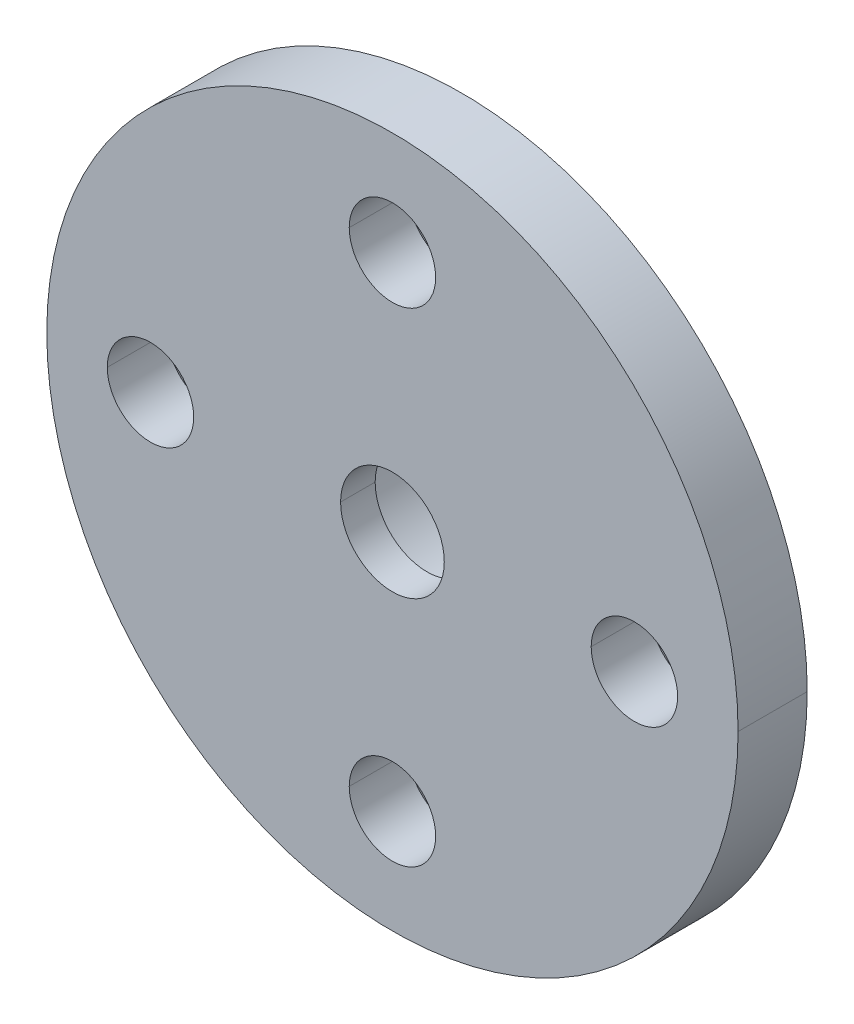
ISO-10303-21;
HEADER;
FILE_DESCRIPTION(('STEP AP214'),'2;1');
FILE_NAME('part.step','',(''),(''),'','','');
FILE_SCHEMA(('AUTOMOTIVE_DESIGN { 1 0 10303 214 1 1 1 1 }'));
ENDSEC;
DATA;
#1=APPLICATION_CONTEXT('core data for automotive mechanical design processes');
#2=APPLICATION_PROTOCOL_DEFINITION('international standard','automotive_design',2000,#1);
#3=PRODUCT_CONTEXT('',#1,'mechanical');
#4=PRODUCT('Part','Part','',(#3));
#5=PRODUCT_RELATED_PRODUCT_CATEGORY('part','',(#4));
#6=PRODUCT_DEFINITION_FORMATION('','',#4);
#7=PRODUCT_DEFINITION_CONTEXT('part definition',#1,'design');
#8=PRODUCT_DEFINITION('design','',#6,#7);
#9=PRODUCT_DEFINITION_SHAPE('','',#8);
#10=(LENGTH_UNIT() NAMED_UNIT(*) SI_UNIT(.MILLI.,.METRE.));
#11=(NAMED_UNIT(*) PLANE_ANGLE_UNIT() SI_UNIT($,.RADIAN.));
#12=(NAMED_UNIT(*) SI_UNIT($,.STERADIAN.) SOLID_ANGLE_UNIT());
#13=UNCERTAINTY_MEASURE_WITH_UNIT(LENGTH_MEASURE(1.E-05),#10,'distance_accuracy_value','');
#14=(GEOMETRIC_REPRESENTATION_CONTEXT(3) GLOBAL_UNCERTAINTY_ASSIGNED_CONTEXT((#13)) GLOBAL_UNIT_ASSIGNED_CONTEXT((#10,
#11,#12)) REPRESENTATION_CONTEXT('',''));
#15=CARTESIAN_POINT('',(0.,0.,0.));
#16=DIRECTION('',(0.,0.,1.));
#17=DIRECTION('',(1.,0.,0.));
#18=AXIS2_PLACEMENT_3D('',#15,#16,#17);
#19=CARTESIAN_POINT('',(0.,0.,-2.));
#20=DIRECTION('',(0.,0.,-1.));
#21=DIRECTION('',(-1.,0.,0.));
#22=AXIS2_PLACEMENT_3D('',#19,#20,#21);
#23=CONICAL_SURFACE('',#22,2.75,0.785398163397449);
#24=DIRECTION('',(0.707106781186548,0.,-0.707106781186547));
#25=VECTOR('',#24,1.);
#26=CARTESIAN_POINT('',(2.75,0.,-2.));
#27=LINE('',#26,#25);
#28=CARTESIAN_POINT('',(2.75,0.,-2.));
#29=VERTEX_POINT('',#28);
#30=CARTESIAN_POINT('',(3.25,0.,-2.5));
#31=VERTEX_POINT('',#30);
#32=EDGE_CURVE('E627',#29,#31,#27,.T.);
#33=ORIENTED_EDGE('',*,*,#32,.F.);
#34=CARTESIAN_POINT('',(0.,0.,-2.));
#35=DIRECTION('',(0.,0.,-1.));
#36=DIRECTION('',(-1.,0.,0.));
#37=AXIS2_PLACEMENT_3D('',#34,#35,#36);
#38=CIRCLE('',#37,2.75);
#39=CARTESIAN_POINT('',(-2.75,0.,-2.));
#40=VERTEX_POINT('',#39);
#41=EDGE_CURVE('E10',#40,#29,#38,.T.);
#42=ORIENTED_EDGE('',*,*,#41,.F.);
#43=DIRECTION('',(-0.707106781186548,0.,-0.707106781186547));
#44=VECTOR('',#43,1.);
#45=CARTESIAN_POINT('',(-2.75,0.,-2.));
#46=LINE('',#45,#44);
#47=CARTESIAN_POINT('',(-3.25,0.,-2.5));
#48=VERTEX_POINT('',#47);
#49=EDGE_CURVE('E231',#40,#48,#46,.T.);
#50=ORIENTED_EDGE('',*,*,#49,.T.);
#51=CARTESIAN_POINT('',(0.,0.,-2.5));
#52=DIRECTION('',(0.,0.,1.));
#53=DIRECTION('',(-1.,0.,0.));
#54=AXIS2_PLACEMENT_3D('',#51,#52,#53);
#55=CIRCLE('',#54,3.25);
#56=EDGE_CURVE('E429',#31,#48,#55,.T.);
#57=ORIENTED_EDGE('',*,*,#56,.F.);
#58=EDGE_LOOP('',(#33,#42,#50,#57));
#59=FACE_BOUND('',#58,.T.);
#60=ADVANCED_FACE('F15',(#59),#23,.F.);
#61=CARTESIAN_POINT('',(0.,0.,2.001));
#62=DIRECTION('',(0.,0.,-1.));
#63=DIRECTION('',(-1.,0.,0.));
#64=AXIS2_PLACEMENT_3D('',#61,#62,#63);
#65=CYLINDRICAL_SURFACE('',#64,1.5);
#66=DIRECTION('',(0.,0.,-1.));
#67=VECTOR('',#66,1.);
#68=CARTESIAN_POINT('',(1.5,0.,2.001));
#69=LINE('',#68,#67);
#70=CARTESIAN_POINT('',(1.5,0.,2.));
#71=VERTEX_POINT('',#70);
#72=CARTESIAN_POINT('',(1.5,0.,1.));
#73=VERTEX_POINT('',#72);
#74=EDGE_CURVE('E213',#71,#73,#69,.T.);
#75=ORIENTED_EDGE('',*,*,#74,.F.);
#76=CARTESIAN_POINT('',(0.,0.,2.));
#77=DIRECTION('',(0.,0.,-1.));
#78=DIRECTION('',(1.,0.,0.));
#79=AXIS2_PLACEMENT_3D('',#76,#77,#78);
#80=CIRCLE('',#79,1.5);
#81=CARTESIAN_POINT('',(-1.5,0.,2.));
#82=VERTEX_POINT('',#81);
#83=EDGE_CURVE('E208',#82,#71,#80,.T.);
#84=ORIENTED_EDGE('',*,*,#83,.F.);
#85=DIRECTION('',(0.,0.,-1.));
#86=VECTOR('',#85,1.);
#87=CARTESIAN_POINT('',(-1.5,0.,2.001));
#88=LINE('',#87,#86);
#89=CARTESIAN_POINT('',(-1.5,0.,1.));
#90=VERTEX_POINT('',#89);
#91=EDGE_CURVE('E210',#82,#90,#88,.T.);
#92=ORIENTED_EDGE('',*,*,#91,.T.);
#93=CARTESIAN_POINT('',(0.,0.,1.));
#94=DIRECTION('',(0.,0.,-1.));
#95=DIRECTION('',(-1.,0.,0.));
#96=AXIS2_PLACEMENT_3D('',#93,#94,#95);
#97=CIRCLE('',#96,1.5);
#98=EDGE_CURVE('E19',#90,#73,#97,.T.);
#99=ORIENTED_EDGE('',*,*,#98,.T.);
#100=EDGE_LOOP('',(#75,#84,#92,#99));
#101=FACE_BOUND('',#100,.T.);
#102=ADVANCED_FACE('F17',(#101),#65,.F.);
#103=CARTESIAN_POINT('',(0.,0.,9.77817459305202));
#104=DIRECTION('',(0.,0.,-1.));
#105=DIRECTION('',(-1.,0.,0.));
#106=AXIS2_PLACEMENT_3D('',#103,#104,#105);
#107=CYLINDRICAL_SURFACE('',#106,2.75);
#108=DIRECTION('',(0.,0.,-1.));
#109=VECTOR('',#108,1.);
#110=CARTESIAN_POINT('',(2.75,0.,9.77817459305202));
#111=LINE('',#110,#109);
#112=CARTESIAN_POINT('',(2.75,0.,1.));
#113=VERTEX_POINT('',#112);
#114=EDGE_CURVE('E246',#113,#29,#111,.T.);
#115=ORIENTED_EDGE('',*,*,#114,.F.);
#116=CARTESIAN_POINT('',(0.,0.,1.));
#117=DIRECTION('',(0.,0.,-1.));
#118=DIRECTION('',(1.,0.,0.));
#119=AXIS2_PLACEMENT_3D('',#116,#117,#118);
#120=CIRCLE('',#119,2.75);
#121=CARTESIAN_POINT('',(-2.75,0.,1.));
#122=VERTEX_POINT('',#121);
#123=EDGE_CURVE('E431',#122,#113,#120,.T.);
#124=ORIENTED_EDGE('',*,*,#123,.F.);
#125=DIRECTION('',(0.,0.,-1.));
#126=VECTOR('',#125,1.);
#127=CARTESIAN_POINT('',(-2.75,0.,9.77817459305202));
#128=LINE('',#127,#126);
#129=EDGE_CURVE('E250',#122,#40,#128,.T.);
#130=ORIENTED_EDGE('',*,*,#129,.T.);
#131=ORIENTED_EDGE('',*,*,#41,.T.);
#132=EDGE_LOOP('',(#115,#124,#130,#131));
#133=FACE_BOUND('',#132,.T.);
#134=ADVANCED_FACE('F496',(#133),#107,.F.);
#135=CARTESIAN_POINT('',(0.,0.,1.));
#136=DIRECTION('',(0.,0.,1.));
#137=DIRECTION('',(1.,0.,0.));
#138=AXIS2_PLACEMENT_3D('',#135,#136,#137);
#139=PLANE('',#138);
#140=ORIENTED_EDGE('',*,*,#98,.F.);
#141=CARTESIAN_POINT('',(0.,0.,1.));
#142=DIRECTION('',(0.,0.,-1.));
#143=DIRECTION('',(-1.,0.,0.));
#144=AXIS2_PLACEMENT_3D('',#141,#142,#143);
#145=CIRCLE('',#144,1.5);
#146=EDGE_CURVE('E224',#73,#90,#145,.T.);
#147=ORIENTED_EDGE('',*,*,#146,.F.);
#148=EDGE_LOOP('',(#140,#147));
#149=FACE_BOUND('',#148,.T.);
#150=ORIENTED_EDGE('',*,*,#123,.T.);
#151=CARTESIAN_POINT('',(0.,0.,1.));
#152=DIRECTION('',(0.,0.,-1.));
#153=DIRECTION('',(1.,0.,0.));
#154=AXIS2_PLACEMENT_3D('',#151,#152,#153);
#155=CIRCLE('',#154,2.75);
#156=EDGE_CURVE('E226',#113,#122,#155,.T.);
#157=ORIENTED_EDGE('',*,*,#156,.T.);
#158=EDGE_LOOP('',(#150,#157));
#159=FACE_BOUND('',#158,.T.);
#160=ADVANCED_FACE('F442',(#149,#159),#139,.F.);
#161=CARTESIAN_POINT('',(0.,0.,-2.5));
#162=DIRECTION('',(0.,0.,-1.));
#163=DIRECTION('',(0.,-1.,0.));
#164=AXIS2_PLACEMENT_3D('',#161,#162,#163);
#165=PLANE('',#164);
#166=CARTESIAN_POINT('',(0.,0.,-2.5));
#167=DIRECTION('',(0.,0.,1.));
#168=DIRECTION('',(-1.,0.,0.));
#169=AXIS2_PLACEMENT_3D('',#166,#167,#168);
#170=CIRCLE('',#169,3.25);
#171=EDGE_CURVE('E240',#48,#31,#170,.T.);
#172=ORIENTED_EDGE('',*,*,#171,.T.);
#173=ORIENTED_EDGE('',*,*,#56,.T.);
#174=EDGE_LOOP('',(#172,#173));
#175=FACE_BOUND('',#174,.T.);
#176=CARTESIAN_POINT('',(0.,0.,-2.5));
#177=DIRECTION('',(0.,0.,-1.));
#178=DIRECTION('',(-1.,0.,0.));
#179=AXIS2_PLACEMENT_3D('',#176,#177,#178);
#180=CIRCLE('',#179,4.5);
#181=CARTESIAN_POINT('',(4.5,0.,-2.5));
#182=VERTEX_POINT('',#181);
#183=CARTESIAN_POINT('',(-4.5,0.,-2.5));
#184=VERTEX_POINT('',#183);
#185=EDGE_CURVE('E428',#182,#184,#180,.T.);
#186=ORIENTED_EDGE('',*,*,#185,.T.);
#187=CARTESIAN_POINT('',(0.,0.,-2.5));
#188=DIRECTION('',(0.,0.,-1.));
#189=DIRECTION('',(-1.,0.,0.));
#190=AXIS2_PLACEMENT_3D('',#187,#188,#189);
#191=CIRCLE('',#190,4.5);
#192=EDGE_CURVE('E254',#184,#182,#191,.T.);
#193=ORIENTED_EDGE('',*,*,#192,.T.);
#194=EDGE_LOOP('',(#186,#193));
#195=FACE_BOUND('',#194,.T.);
#196=ADVANCED_FACE('F884',(#175,#195),#165,.T.);
#197=CARTESIAN_POINT('',(0.,0.,-2.5));
#198=DIRECTION('',(0.,0.,1.));
#199=DIRECTION('',(1.,0.,0.));
#200=AXIS2_PLACEMENT_3D('',#197,#198,#199);
#201=CYLINDRICAL_SURFACE('',#200,4.5);
#202=DIRECTION('',(0.,0.,1.));
#203=VECTOR('',#202,1.);
#204=CARTESIAN_POINT('',(-4.5,0.,-2.5));
#205=LINE('',#204,#203);
#206=CARTESIAN_POINT('',(-4.5,0.,0.));
#207=VERTEX_POINT('',#206);
#208=EDGE_CURVE('E269',#184,#207,#205,.T.);
#209=ORIENTED_EDGE('',*,*,#208,.F.);
#210=ORIENTED_EDGE('',*,*,#185,.F.);
#211=DIRECTION('',(0.,0.,1.));
#212=VECTOR('',#211,1.);
#213=CARTESIAN_POINT('',(4.5,0.,-2.5));
#214=LINE('',#213,#212);
#215=CARTESIAN_POINT('',(4.5,0.,0.));
#216=VERTEX_POINT('',#215);
#217=EDGE_CURVE('E255',#182,#216,#214,.T.);
#218=ORIENTED_EDGE('',*,*,#217,.T.);
#219=CARTESIAN_POINT('',(0.,0.,0.));
#220=DIRECTION('',(0.,0.,-1.));
#221=DIRECTION('',(-1.,0.,0.));
#222=AXIS2_PLACEMENT_3D('',#219,#220,#221);
#223=CIRCLE('',#222,4.5);
#224=EDGE_CURVE('E411',#216,#207,#223,.T.);
#225=ORIENTED_EDGE('',*,*,#224,.T.);
#226=EDGE_LOOP('',(#209,#210,#218,#225));
#227=FACE_BOUND('',#226,.T.);
#228=ADVANCED_FACE('F892',(#227),#201,.T.);
#229=CARTESIAN_POINT('',(-7.,0.,0.));
#230=DIRECTION('',(0.,0.,-1.));
#231=DIRECTION('',(-1.,0.,0.));
#232=AXIS2_PLACEMENT_3D('',#229,#230,#231);
#233=CONICAL_SURFACE('',#232,1.525,0.785398163397448);
#234=DIRECTION('',(0.707106781186548,0.,-0.707106781186548));
#235=VECTOR('',#234,1.);
#236=CARTESIAN_POINT('',(-5.475,0.,0.));
#237=LINE('',#236,#235);
#238=CARTESIAN_POINT('',(-5.75,0.,0.275000000000012));
#239=VERTEX_POINT('',#238);
#240=CARTESIAN_POINT('',(-5.475,0.,0.));
#241=VERTEX_POINT('',#240);
#242=EDGE_CURVE('E261',#239,#241,#237,.T.);
#243=ORIENTED_EDGE('',*,*,#242,.F.);
#244=CARTESIAN_POINT('',(-7.,0.,0.275000000000012));
#245=DIRECTION('',(0.,0.,-1.));
#246=DIRECTION('',(-1.,0.,0.));
#247=AXIS2_PLACEMENT_3D('',#244,#245,#246);
#248=CIRCLE('',#247,1.24999999999999);
#249=CARTESIAN_POINT('',(-8.25,0.,0.275000000000012));
#250=VERTEX_POINT('',#249);
#251=EDGE_CURVE('E276',#250,#239,#248,.T.);
#252=ORIENTED_EDGE('',*,*,#251,.F.);
#253=DIRECTION('',(-0.707106781186548,0.,-0.707106781186548));
#254=VECTOR('',#253,1.);
#255=CARTESIAN_POINT('',(-8.525,0.,0.));
#256=LINE('',#255,#254);
#257=CARTESIAN_POINT('',(-8.525,0.,0.));
#258=VERTEX_POINT('',#257);
#259=EDGE_CURVE('E281',#250,#258,#256,.T.);
#260=ORIENTED_EDGE('',*,*,#259,.T.);
#261=CARTESIAN_POINT('',(-7.,0.,0.));
#262=DIRECTION('',(0.,0.,-1.));
#263=DIRECTION('',(-1.,0.,0.));
#264=AXIS2_PLACEMENT_3D('',#261,#262,#263);
#265=CIRCLE('',#264,1.525);
#266=EDGE_CURVE('E414',#258,#241,#265,.T.);
#267=ORIENTED_EDGE('',*,*,#266,.T.);
#268=EDGE_LOOP('',(#243,#252,#260,#267));
#269=FACE_BOUND('',#268,.T.);
#270=ADVANCED_FACE('F511',(#269),#233,.F.);
#271=CARTESIAN_POINT('',(-7.,0.,0.));
#272=DIRECTION('',(0.,0.,-1.));
#273=DIRECTION('',(-1.,0.,0.));
#274=AXIS2_PLACEMENT_3D('',#271,#272,#273);
#275=CYLINDRICAL_SURFACE('',#274,1.25);
#276=DIRECTION('',(0.,0.,-1.));
#277=VECTOR('',#276,1.);
#278=CARTESIAN_POINT('',(-5.75,0.,0.));
#279=LINE('',#278,#277);
#280=CARTESIAN_POINT('',(-5.75,0.,2.));
#281=VERTEX_POINT('',#280);
#282=EDGE_CURVE('E285',#281,#239,#279,.T.);
#283=ORIENTED_EDGE('',*,*,#282,.F.);
#284=CARTESIAN_POINT('',(-7.,0.,2.));
#285=DIRECTION('',(0.,0.,-1.));
#286=DIRECTION('',(-1.,0.,0.));
#287=AXIS2_PLACEMENT_3D('',#284,#285,#286);
#288=CIRCLE('',#287,1.25);
#289=CARTESIAN_POINT('',(-8.25,0.,2.));
#290=VERTEX_POINT('',#289);
#291=EDGE_CURVE('E218',#290,#281,#288,.T.);
#292=ORIENTED_EDGE('',*,*,#291,.F.);
#293=DIRECTION('',(0.,0.,-1.));
#294=VECTOR('',#293,1.);
#295=CARTESIAN_POINT('',(-8.25,0.,0.));
#296=LINE('',#295,#294);
#297=EDGE_CURVE('E289',#290,#250,#296,.T.);
#298=ORIENTED_EDGE('',*,*,#297,.T.);
#299=ORIENTED_EDGE('',*,*,#251,.T.);
#300=EDGE_LOOP('',(#283,#292,#298,#299));
#301=FACE_BOUND('',#300,.T.);
#302=ADVANCED_FACE('F507',(#301),#275,.F.);
#303=CARTESIAN_POINT('',(0.,7.,0.));
#304=DIRECTION('',(0.,0.,-1.));
#305=DIRECTION('',(-1.,0.,0.));
#306=AXIS2_PLACEMENT_3D('',#303,#304,#305);
#307=CONICAL_SURFACE('',#306,1.525,0.785398163397448);
#308=DIRECTION('',(0.707106781186548,0.,-0.707106781186548));
#309=VECTOR('',#308,1.);
#310=CARTESIAN_POINT('',(1.525,7.,0.));
#311=LINE('',#310,#309);
#312=CARTESIAN_POINT('',(1.24999999999999,7.,0.275000000000012));
#313=VERTEX_POINT('',#312);
#314=CARTESIAN_POINT('',(1.525,7.,0.));
#315=VERTEX_POINT('',#314);
#316=EDGE_CURVE('E297',#313,#315,#311,.T.);
#317=ORIENTED_EDGE('',*,*,#316,.F.);
#318=CARTESIAN_POINT('',(0.,7.,0.275000000000012));
#319=DIRECTION('',(0.,0.,-1.));
#320=DIRECTION('',(-1.,0.,0.));
#321=AXIS2_PLACEMENT_3D('',#318,#319,#320);
#322=CIRCLE('',#321,1.24999999999999);
#323=CARTESIAN_POINT('',(-1.24999999999999,7.,0.275000000000012));
#324=VERTEX_POINT('',#323);
#325=EDGE_CURVE('E273',#324,#313,#322,.T.);
#326=ORIENTED_EDGE('',*,*,#325,.F.);
#327=DIRECTION('',(-0.707106781186548,0.,-0.707106781186548));
#328=VECTOR('',#327,1.);
#329=CARTESIAN_POINT('',(-1.525,7.,0.));
#330=LINE('',#329,#328);
#331=CARTESIAN_POINT('',(-1.525,7.,0.));
#332=VERTEX_POINT('',#331);
#333=EDGE_CURVE('E311',#324,#332,#330,.T.);
#334=ORIENTED_EDGE('',*,*,#333,.T.);
#335=CARTESIAN_POINT('',(0.,7.,0.));
#336=DIRECTION('',(0.,0.,-1.));
#337=DIRECTION('',(-1.,0.,0.));
#338=AXIS2_PLACEMENT_3D('',#335,#336,#337);
#339=CIRCLE('',#338,1.525);
#340=EDGE_CURVE('E368',#332,#315,#339,.T.);
#341=ORIENTED_EDGE('',*,*,#340,.T.);
#342=EDGE_LOOP('',(#317,#326,#334,#341));
#343=FACE_BOUND('',#342,.T.);
#344=ADVANCED_FACE('F510',(#343),#307,.F.);
#345=CARTESIAN_POINT('',(0.,7.,0.));
#346=DIRECTION('',(0.,0.,-1.));
#347=DIRECTION('',(-1.,0.,0.));
#348=AXIS2_PLACEMENT_3D('',#345,#346,#347);
#349=CYLINDRICAL_SURFACE('',#348,1.25);
#350=DIRECTION('',(0.,0.,-1.));
#351=VECTOR('',#350,1.);
#352=CARTESIAN_POINT('',(1.25,7.,0.));
#353=LINE('',#352,#351);
#354=CARTESIAN_POINT('',(1.25,7.,2.));
#355=VERTEX_POINT('',#354);
#356=EDGE_CURVE('E316',#355,#313,#353,.T.);
#357=ORIENTED_EDGE('',*,*,#356,.F.);
#358=CARTESIAN_POINT('',(0.,7.,2.));
#359=DIRECTION('',(0.,0.,-1.));
#360=DIRECTION('',(-1.,0.,0.));
#361=AXIS2_PLACEMENT_3D('',#358,#359,#360);
#362=CIRCLE('',#361,1.25);
#363=CARTESIAN_POINT('',(-1.25,7.,2.));
#364=VERTEX_POINT('',#363);
#365=EDGE_CURVE('E402',#364,#355,#362,.T.);
#366=ORIENTED_EDGE('',*,*,#365,.F.);
#367=DIRECTION('',(0.,0.,-1.));
#368=VECTOR('',#367,1.);
#369=CARTESIAN_POINT('',(-1.25,7.,0.));
#370=LINE('',#369,#368);
#371=EDGE_CURVE('E323',#364,#324,#370,.T.);
#372=ORIENTED_EDGE('',*,*,#371,.T.);
#373=ORIENTED_EDGE('',*,*,#325,.T.);
#374=EDGE_LOOP('',(#357,#366,#372,#373));
#375=FACE_BOUND('',#374,.T.);
#376=ADVANCED_FACE('F917',(#375),#349,.F.);
#377=CARTESIAN_POINT('',(7.,0.,0.));
#378=DIRECTION('',(0.,0.,-1.));
#379=DIRECTION('',(-1.,0.,0.));
#380=AXIS2_PLACEMENT_3D('',#377,#378,#379);
#381=CONICAL_SURFACE('',#380,1.525,0.785398163397452);
#382=DIRECTION('',(0.70710678118655,0.,-0.707106781186545));
#383=VECTOR('',#382,1.);
#384=CARTESIAN_POINT('',(8.525,0.,0.));
#385=LINE('',#384,#383);
#386=CARTESIAN_POINT('',(8.25,0.,0.275000000000012));
#387=VERTEX_POINT('',#386);
#388=CARTESIAN_POINT('',(8.525,0.,0.));
#389=VERTEX_POINT('',#388);
#390=EDGE_CURVE('E337',#387,#389,#385,.T.);
#391=ORIENTED_EDGE('',*,*,#390,.F.);
#392=CARTESIAN_POINT('',(7.,0.,0.275000000000012));
#393=DIRECTION('',(0.,0.,-1.));
#394=DIRECTION('',(-1.,0.,0.));
#395=AXIS2_PLACEMENT_3D('',#392,#393,#394);
#396=CIRCLE('',#395,1.24999999999999);
#397=CARTESIAN_POINT('',(5.75,0.,0.275000000000012));
#398=VERTEX_POINT('',#397);
#399=EDGE_CURVE('E277',#398,#387,#396,.T.);
#400=ORIENTED_EDGE('',*,*,#399,.F.);
#401=DIRECTION('',(-0.70710678118655,0.,-0.707106781186545));
#402=VECTOR('',#401,1.);
#403=CARTESIAN_POINT('',(5.475,0.,0.));
#404=LINE('',#403,#402);
#405=CARTESIAN_POINT('',(5.475,0.,0.));
#406=VERTEX_POINT('',#405);
#407=EDGE_CURVE('E345',#398,#406,#404,.T.);
#408=ORIENTED_EDGE('',*,*,#407,.T.);
#409=CARTESIAN_POINT('',(7.,0.,0.));
#410=DIRECTION('',(0.,0.,-1.));
#411=DIRECTION('',(-1.,0.,0.));
#412=AXIS2_PLACEMENT_3D('',#409,#410,#411);
#413=CIRCLE('',#412,1.525);
#414=EDGE_CURVE('E364',#406,#389,#413,.T.);
#415=ORIENTED_EDGE('',*,*,#414,.T.);
#416=EDGE_LOOP('',(#391,#400,#408,#415));
#417=FACE_BOUND('',#416,.T.);
#418=ADVANCED_FACE('F927',(#417),#381,.F.);
#419=CARTESIAN_POINT('',(7.,0.,0.));
#420=DIRECTION('',(0.,0.,-1.));
#421=DIRECTION('',(-1.,0.,0.));
#422=AXIS2_PLACEMENT_3D('',#419,#420,#421);
#423=CYLINDRICAL_SURFACE('',#422,1.25);
#424=DIRECTION('',(0.,0.,-1.));
#425=VECTOR('',#424,1.);
#426=CARTESIAN_POINT('',(8.25,0.,0.));
#427=LINE('',#426,#425);
#428=CARTESIAN_POINT('',(8.25,0.,2.));
#429=VERTEX_POINT('',#428);
#430=EDGE_CURVE('E307',#429,#387,#427,.T.);
#431=ORIENTED_EDGE('',*,*,#430,.F.);
#432=CARTESIAN_POINT('',(7.,0.,2.));
#433=DIRECTION('',(0.,0.,-1.));
#434=DIRECTION('',(-1.,0.,0.));
#435=AXIS2_PLACEMENT_3D('',#432,#433,#434);
#436=CIRCLE('',#435,1.25);
#437=CARTESIAN_POINT('',(5.75,0.,2.));
#438=VERTEX_POINT('',#437);
#439=EDGE_CURVE('E405',#438,#429,#436,.T.);
#440=ORIENTED_EDGE('',*,*,#439,.F.);
#441=DIRECTION('',(0.,0.,-1.));
#442=VECTOR('',#441,1.);
#443=CARTESIAN_POINT('',(5.75,0.,0.));
#444=LINE('',#443,#442);
#445=EDGE_CURVE('E302',#438,#398,#444,.T.);
#446=ORIENTED_EDGE('',*,*,#445,.T.);
#447=ORIENTED_EDGE('',*,*,#399,.T.);
#448=EDGE_LOOP('',(#431,#440,#446,#447));
#449=FACE_BOUND('',#448,.T.);
#450=ADVANCED_FACE('F938',(#449),#423,.F.);
#451=CARTESIAN_POINT('',(0.,-7.,0.));
#452=DIRECTION('',(0.,0.,-1.));
#453=DIRECTION('',(-1.,0.,0.));
#454=AXIS2_PLACEMENT_3D('',#451,#452,#453);
#455=CONICAL_SURFACE('',#454,1.525,0.785398163397448);
#456=DIRECTION('',(0.707106781186548,0.,-0.707106781186548));
#457=VECTOR('',#456,1.);
#458=CARTESIAN_POINT('',(1.525,-7.,0.));
#459=LINE('',#458,#457);
#460=CARTESIAN_POINT('',(1.24999999999999,-7.,0.275000000000012));
#461=VERTEX_POINT('',#460);
#462=CARTESIAN_POINT('',(1.525,-7.,0.));
#463=VERTEX_POINT('',#462);
#464=EDGE_CURVE('E333',#461,#463,#459,.T.);
#465=ORIENTED_EDGE('',*,*,#464,.F.);
#466=CARTESIAN_POINT('',(0.,-7.,0.275000000000012));
#467=DIRECTION('',(0.,0.,-1.));
#468=DIRECTION('',(-1.,0.,0.));
#469=AXIS2_PLACEMENT_3D('',#466,#467,#468);
#470=CIRCLE('',#469,1.24999999999999);
#471=CARTESIAN_POINT('',(-1.24999999999999,-7.,0.275000000000012));
#472=VERTEX_POINT('',#471);
#473=EDGE_CURVE('E421',#472,#461,#470,.T.);
#474=ORIENTED_EDGE('',*,*,#473,.F.);
#475=DIRECTION('',(-0.707106781186548,0.,-0.707106781186548));
#476=VECTOR('',#475,1.);
#477=CARTESIAN_POINT('',(-1.525,-7.,0.));
#478=LINE('',#477,#476);
#479=CARTESIAN_POINT('',(-1.525,-7.,0.));
#480=VERTEX_POINT('',#479);
#481=EDGE_CURVE('E332',#472,#480,#478,.T.);
#482=ORIENTED_EDGE('',*,*,#481,.T.);
#483=CARTESIAN_POINT('',(0.,-7.,0.));
#484=DIRECTION('',(0.,0.,-1.));
#485=DIRECTION('',(-1.,0.,0.));
#486=AXIS2_PLACEMENT_3D('',#483,#484,#485);
#487=CIRCLE('',#486,1.525);
#488=EDGE_CURVE('E367',#480,#463,#487,.T.);
#489=ORIENTED_EDGE('',*,*,#488,.T.);
#490=EDGE_LOOP('',(#465,#474,#482,#489));
#491=FACE_BOUND('',#490,.T.);
#492=ADVANCED_FACE('F485',(#491),#455,.F.);
#493=CARTESIAN_POINT('',(0.,-7.,0.));
#494=DIRECTION('',(0.,0.,-1.));
#495=DIRECTION('',(-1.,0.,0.));
#496=AXIS2_PLACEMENT_3D('',#493,#494,#495);
#497=CYLINDRICAL_SURFACE('',#496,1.25);
#498=DIRECTION('',(0.,0.,-1.));
#499=VECTOR('',#498,1.);
#500=CARTESIAN_POINT('',(1.25,-7.,0.));
#501=LINE('',#500,#499);
#502=CARTESIAN_POINT('',(1.25,-7.,2.));
#503=VERTEX_POINT('',#502);
#504=EDGE_CURVE('E357',#503,#461,#501,.T.);
#505=ORIENTED_EDGE('',*,*,#504,.F.);
#506=CARTESIAN_POINT('',(0.,-7.,2.));
#507=DIRECTION('',(0.,0.,-1.));
#508=DIRECTION('',(-1.,0.,0.));
#509=AXIS2_PLACEMENT_3D('',#506,#507,#508);
#510=CIRCLE('',#509,1.25);
#511=CARTESIAN_POINT('',(-1.25,-7.,2.));
#512=VERTEX_POINT('',#511);
#513=EDGE_CURVE('E408',#512,#503,#510,.T.);
#514=ORIENTED_EDGE('',*,*,#513,.F.);
#515=DIRECTION('',(0.,0.,-1.));
#516=VECTOR('',#515,1.);
#517=CARTESIAN_POINT('',(-1.25,-7.,0.));
#518=LINE('',#517,#516);
#519=EDGE_CURVE('E378',#512,#472,#518,.T.);
#520=ORIENTED_EDGE('',*,*,#519,.T.);
#521=ORIENTED_EDGE('',*,*,#473,.T.);
#522=EDGE_LOOP('',(#505,#514,#520,#521));
#523=FACE_BOUND('',#522,.T.);
#524=ADVANCED_FACE('F475',(#523),#497,.F.);
#525=CARTESIAN_POINT('',(0.,0.,0.));
#526=DIRECTION('',(0.,0.,1.));
#527=DIRECTION('',(1.,0.,0.));
#528=AXIS2_PLACEMENT_3D('',#525,#526,#527);
#529=PLANE('',#528);
#530=ORIENTED_EDGE('',*,*,#488,.F.);
#531=CARTESIAN_POINT('',(0.,-7.,0.));
#532=DIRECTION('',(0.,0.,-1.));
#533=DIRECTION('',(-1.,0.,0.));
#534=AXIS2_PLACEMENT_3D('',#531,#532,#533);
#535=CIRCLE('',#534,1.525);
#536=EDGE_CURVE('E328',#463,#480,#535,.T.);
#537=ORIENTED_EDGE('',*,*,#536,.F.);
#538=EDGE_LOOP('',(#530,#537));
#539=FACE_BOUND('',#538,.T.);
#540=ORIENTED_EDGE('',*,*,#414,.F.);
#541=CARTESIAN_POINT('',(7.,0.,0.));
#542=DIRECTION('',(0.,0.,-1.));
#543=DIRECTION('',(-1.,0.,0.));
#544=AXIS2_PLACEMENT_3D('',#541,#542,#543);
#545=CIRCLE('',#544,1.525);
#546=EDGE_CURVE('E341',#389,#406,#545,.T.);
#547=ORIENTED_EDGE('',*,*,#546,.F.);
#548=EDGE_LOOP('',(#540,#547));
#549=FACE_BOUND('',#548,.T.);
#550=ORIENTED_EDGE('',*,*,#340,.F.);
#551=CARTESIAN_POINT('',(0.,7.,0.));
#552=DIRECTION('',(0.,0.,-1.));
#553=DIRECTION('',(-1.,0.,0.));
#554=AXIS2_PLACEMENT_3D('',#551,#552,#553);
#555=CIRCLE('',#554,1.525);
#556=EDGE_CURVE('E301',#315,#332,#555,.T.);
#557=ORIENTED_EDGE('',*,*,#556,.F.);
#558=EDGE_LOOP('',(#550,#557));
#559=FACE_BOUND('',#558,.T.);
#560=ORIENTED_EDGE('',*,*,#266,.F.);
#561=CARTESIAN_POINT('',(-7.,0.,0.));
#562=DIRECTION('',(0.,0.,-1.));
#563=DIRECTION('',(-1.,0.,0.));
#564=AXIS2_PLACEMENT_3D('',#561,#562,#563);
#565=CIRCLE('',#564,1.525);
#566=EDGE_CURVE('E265',#241,#258,#565,.T.);
#567=ORIENTED_EDGE('',*,*,#566,.F.);
#568=EDGE_LOOP('',(#560,#567));
#569=FACE_BOUND('',#568,.T.);
#570=ORIENTED_EDGE('',*,*,#224,.F.);
#571=CARTESIAN_POINT('',(0.,0.,0.));
#572=DIRECTION('',(0.,0.,-1.));
#573=DIRECTION('',(-1.,0.,0.));
#574=AXIS2_PLACEMENT_3D('',#571,#572,#573);
#575=CIRCLE('',#574,4.5);
#576=EDGE_CURVE('E260',#207,#216,#575,.T.);
#577=ORIENTED_EDGE('',*,*,#576,.F.);
#578=EDGE_LOOP('',(#570,#577));
#579=FACE_BOUND('',#578,.T.);
#580=CARTESIAN_POINT('',(0.,0.,0.));
#581=DIRECTION('',(0.,0.,1.));
#582=DIRECTION('',(1.,0.,0.));
#583=AXIS2_PLACEMENT_3D('',#580,#581,#582);
#584=CIRCLE('',#583,10.);
#585=CARTESIAN_POINT('',(-10.,0.,0.));
#586=VERTEX_POINT('',#585);
#587=CARTESIAN_POINT('',(10.,0.,0.));
#588=VERTEX_POINT('',#587);
#589=EDGE_CURVE('E37',#586,#588,#584,.T.);
#590=ORIENTED_EDGE('',*,*,#589,.F.);
#591=CARTESIAN_POINT('',(0.,0.,0.));
#592=DIRECTION('',(0.,0.,1.));
#593=DIRECTION('',(1.,0.,0.));
#594=AXIS2_PLACEMENT_3D('',#591,#592,#593);
#595=CIRCLE('',#594,10.);
#596=EDGE_CURVE('E390',#588,#586,#595,.T.);
#597=ORIENTED_EDGE('',*,*,#596,.F.);
#598=EDGE_LOOP('',(#590,#597));
#599=FACE_BOUND('',#598,.T.);
#600=ADVANCED_FACE('F473',(#539,#549,#559,#569,#579,#599),#529,.F.);
#601=CARTESIAN_POINT('',(0.,0.,2.));
#602=DIRECTION('',(0.,0.,1.));
#603=DIRECTION('',(1.,0.,0.));
#604=AXIS2_PLACEMENT_3D('',#601,#602,#603);
#605=PLANE('',#604);
#606=ORIENTED_EDGE('',*,*,#513,.T.);
#607=CARTESIAN_POINT('',(0.,-7.,2.));
#608=DIRECTION('',(0.,0.,-1.));
#609=DIRECTION('',(-1.,0.,0.));
#610=AXIS2_PLACEMENT_3D('',#607,#608,#609);
#611=CIRCLE('',#610,1.25);
#612=EDGE_CURVE('E353',#503,#512,#611,.T.);
#613=ORIENTED_EDGE('',*,*,#612,.T.);
#614=EDGE_LOOP('',(#606,#613));
#615=FACE_BOUND('',#614,.T.);
#616=ORIENTED_EDGE('',*,*,#439,.T.);
#617=CARTESIAN_POINT('',(7.,0.,2.));
#618=DIRECTION('',(0.,0.,-1.));
#619=DIRECTION('',(-1.,0.,0.));
#620=AXIS2_PLACEMENT_3D('',#617,#618,#619);
#621=CIRCLE('',#620,1.25);
#622=EDGE_CURVE('E349',#429,#438,#621,.T.);
#623=ORIENTED_EDGE('',*,*,#622,.T.);
#624=EDGE_LOOP('',(#616,#623));
#625=FACE_BOUND('',#624,.T.);
#626=ORIENTED_EDGE('',*,*,#365,.T.);
#627=CARTESIAN_POINT('',(0.,7.,2.));
#628=DIRECTION('',(0.,0.,-1.));
#629=DIRECTION('',(-1.,0.,0.));
#630=AXIS2_PLACEMENT_3D('',#627,#628,#629);
#631=CIRCLE('',#630,1.25);
#632=EDGE_CURVE('E312',#355,#364,#631,.T.);
#633=ORIENTED_EDGE('',*,*,#632,.T.);
#634=EDGE_LOOP('',(#626,#633));
#635=FACE_BOUND('',#634,.T.);
#636=ORIENTED_EDGE('',*,*,#291,.T.);
#637=CARTESIAN_POINT('',(-7.,0.,2.));
#638=DIRECTION('',(0.,0.,-1.));
#639=DIRECTION('',(-1.,0.,0.));
#640=AXIS2_PLACEMENT_3D('',#637,#638,#639);
#641=CIRCLE('',#640,1.25);
#642=EDGE_CURVE('E243',#281,#290,#641,.T.);
#643=ORIENTED_EDGE('',*,*,#642,.T.);
#644=EDGE_LOOP('',(#636,#643));
#645=FACE_BOUND('',#644,.T.);
#646=ORIENTED_EDGE('',*,*,#83,.T.);
#647=CARTESIAN_POINT('',(0.,0.,2.));
#648=DIRECTION('',(0.,0.,-1.));
#649=DIRECTION('',(1.,0.,0.));
#650=AXIS2_PLACEMENT_3D('',#647,#648,#649);
#651=CIRCLE('',#650,1.5);
#652=EDGE_CURVE('E222',#71,#82,#651,.T.);
#653=ORIENTED_EDGE('',*,*,#652,.T.);
#654=EDGE_LOOP('',(#646,#653));
#655=FACE_BOUND('',#654,.T.);
#656=CARTESIAN_POINT('',(0.,0.,2.));
#657=DIRECTION('',(0.,0.,1.));
#658=DIRECTION('',(1.,0.,0.));
#659=AXIS2_PLACEMENT_3D('',#656,#657,#658);
#660=CIRCLE('',#659,10.);
#661=CARTESIAN_POINT('',(-10.,0.,2.));
#662=VERTEX_POINT('',#661);
#663=CARTESIAN_POINT('',(10.,0.,2.));
#664=VERTEX_POINT('',#663);
#665=EDGE_CURVE('E395',#662,#664,#660,.T.);
#666=ORIENTED_EDGE('',*,*,#665,.T.);
#667=CARTESIAN_POINT('',(0.,0.,2.));
#668=DIRECTION('',(0.,0.,1.));
#669=DIRECTION('',(1.,0.,0.));
#670=AXIS2_PLACEMENT_3D('',#667,#668,#669);
#671=CIRCLE('',#670,10.);
#672=EDGE_CURVE('E382',#664,#662,#671,.T.);
#673=ORIENTED_EDGE('',*,*,#672,.T.);
#674=EDGE_LOOP('',(#666,#673));
#675=FACE_BOUND('',#674,.T.);
#676=ADVANCED_FACE('F228',(#615,#625,#635,#645,#655,#675),#605,.T.);
#677=CARTESIAN_POINT('',(0.,0.,2.));
#678=DIRECTION('',(0.,0.,-1.));
#679=DIRECTION('',(-1.,0.,0.));
#680=AXIS2_PLACEMENT_3D('',#677,#678,#679);
#681=CYLINDRICAL_SURFACE('',#680,10.);
#682=DIRECTION('',(0.,0.,-1.));
#683=VECTOR('',#682,1.);
#684=CARTESIAN_POINT('',(10.,0.,2.));
#685=LINE('',#684,#683);
#686=EDGE_CURVE('E386',#664,#588,#685,.T.);
#687=ORIENTED_EDGE('',*,*,#686,.F.);
#688=ORIENTED_EDGE('',*,*,#665,.F.);
#689=DIRECTION('',(0.,0.,-1.));
#690=VECTOR('',#689,1.);
#691=CARTESIAN_POINT('',(-10.,0.,2.));
#692=LINE('',#691,#690);
#693=EDGE_CURVE('E394',#662,#586,#692,.T.);
#694=ORIENTED_EDGE('',*,*,#693,.T.);
#695=ORIENTED_EDGE('',*,*,#589,.T.);
#696=EDGE_LOOP('',(#687,#688,#694,#695));
#697=FACE_BOUND('',#696,.T.);
#698=ADVANCED_FACE('F469',(#697),#681,.T.);
#699=CARTESIAN_POINT('',(0.,0.,2.));
#700=DIRECTION('',(0.,0.,-1.));
#701=DIRECTION('',(-1.,0.,0.));
#702=AXIS2_PLACEMENT_3D('',#699,#700,#701);
#703=CYLINDRICAL_SURFACE('',#702,10.);
#704=ORIENTED_EDGE('',*,*,#672,.F.);
#705=ORIENTED_EDGE('',*,*,#686,.T.);
#706=ORIENTED_EDGE('',*,*,#596,.T.);
#707=ORIENTED_EDGE('',*,*,#693,.F.);
#708=EDGE_LOOP('',(#704,#705,#706,#707));
#709=FACE_BOUND('',#708,.T.);
#710=ADVANCED_FACE('F472',(#709),#703,.T.);
#711=CARTESIAN_POINT('',(0.,-7.,0.));
#712=DIRECTION('',(0.,0.,-1.));
#713=DIRECTION('',(-1.,0.,0.));
#714=AXIS2_PLACEMENT_3D('',#711,#712,#713);
#715=CYLINDRICAL_SURFACE('',#714,1.25);
#716=ORIENTED_EDGE('',*,*,#612,.F.);
#717=ORIENTED_EDGE('',*,*,#504,.T.);
#718=CARTESIAN_POINT('',(0.,-7.,0.275000000000012));
#719=DIRECTION('',(0.,0.,-1.));
#720=DIRECTION('',(-1.,0.,0.));
#721=AXIS2_PLACEMENT_3D('',#718,#719,#720);
#722=CIRCLE('',#721,1.24999999999999);
#723=EDGE_CURVE('E306',#461,#472,#722,.T.);
#724=ORIENTED_EDGE('',*,*,#723,.T.);
#725=ORIENTED_EDGE('',*,*,#519,.F.);
#726=EDGE_LOOP('',(#716,#717,#724,#725));
#727=FACE_BOUND('',#726,.T.);
#728=ADVANCED_FACE('F520',(#727),#715,.F.);
#729=CARTESIAN_POINT('',(0.,-7.,0.));
#730=DIRECTION('',(0.,0.,-1.));
#731=DIRECTION('',(-1.,0.,0.));
#732=AXIS2_PLACEMENT_3D('',#729,#730,#731);
#733=CONICAL_SURFACE('',#732,1.525,0.785398163397448);
#734=ORIENTED_EDGE('',*,*,#723,.F.);
#735=ORIENTED_EDGE('',*,*,#464,.T.);
#736=ORIENTED_EDGE('',*,*,#536,.T.);
#737=ORIENTED_EDGE('',*,*,#481,.F.);
#738=EDGE_LOOP('',(#734,#735,#736,#737));
#739=FACE_BOUND('',#738,.T.);
#740=ADVANCED_FACE('F518',(#739),#733,.F.);
#741=CARTESIAN_POINT('',(7.,0.,0.));
#742=DIRECTION('',(0.,0.,-1.));
#743=DIRECTION('',(-1.,0.,0.));
#744=AXIS2_PLACEMENT_3D('',#741,#742,#743);
#745=CYLINDRICAL_SURFACE('',#744,1.25);
#746=ORIENTED_EDGE('',*,*,#622,.F.);
#747=ORIENTED_EDGE('',*,*,#430,.T.);
#748=CARTESIAN_POINT('',(7.,0.,0.275000000000012));
#749=DIRECTION('',(0.,0.,-1.));
#750=DIRECTION('',(-1.,0.,0.));
#751=AXIS2_PLACEMENT_3D('',#748,#749,#750);
#752=CIRCLE('',#751,1.24999999999999);
#753=EDGE_CURVE('E326',#387,#398,#752,.T.);
#754=ORIENTED_EDGE('',*,*,#753,.T.);
#755=ORIENTED_EDGE('',*,*,#445,.F.);
#756=EDGE_LOOP('',(#746,#747,#754,#755));
#757=FACE_BOUND('',#756,.T.);
#758=ADVANCED_FACE('F516',(#757),#745,.F.);
#759=CARTESIAN_POINT('',(7.,0.,0.));
#760=DIRECTION('',(0.,0.,-1.));
#761=DIRECTION('',(-1.,0.,0.));
#762=AXIS2_PLACEMENT_3D('',#759,#760,#761);
#763=CONICAL_SURFACE('',#762,1.525,0.785398163397452);
#764=ORIENTED_EDGE('',*,*,#753,.F.);
#765=ORIENTED_EDGE('',*,*,#390,.T.);
#766=ORIENTED_EDGE('',*,*,#546,.T.);
#767=ORIENTED_EDGE('',*,*,#407,.F.);
#768=EDGE_LOOP('',(#764,#765,#766,#767));
#769=FACE_BOUND('',#768,.T.);
#770=ADVANCED_FACE('F505',(#769),#763,.F.);
#771=CARTESIAN_POINT('',(0.,7.,0.));
#772=DIRECTION('',(0.,0.,-1.));
#773=DIRECTION('',(-1.,0.,0.));
#774=AXIS2_PLACEMENT_3D('',#771,#772,#773);
#775=CYLINDRICAL_SURFACE('',#774,1.25);
#776=ORIENTED_EDGE('',*,*,#632,.F.);
#777=ORIENTED_EDGE('',*,*,#356,.T.);
#778=CARTESIAN_POINT('',(0.,7.,0.275000000000012));
#779=DIRECTION('',(0.,0.,-1.));
#780=DIRECTION('',(-1.,0.,0.));
#781=AXIS2_PLACEMENT_3D('',#778,#779,#780);
#782=CIRCLE('',#781,1.24999999999999);
#783=EDGE_CURVE('E293',#313,#324,#782,.T.);
#784=ORIENTED_EDGE('',*,*,#783,.T.);
#785=ORIENTED_EDGE('',*,*,#371,.F.);
#786=EDGE_LOOP('',(#776,#777,#784,#785));
#787=FACE_BOUND('',#786,.T.);
#788=ADVANCED_FACE('F502',(#787),#775,.F.);
#789=CARTESIAN_POINT('',(0.,7.,0.));
#790=DIRECTION('',(0.,0.,-1.));
#791=DIRECTION('',(-1.,0.,0.));
#792=AXIS2_PLACEMENT_3D('',#789,#790,#791);
#793=CONICAL_SURFACE('',#792,1.525,0.785398163397448);
#794=ORIENTED_EDGE('',*,*,#783,.F.);
#795=ORIENTED_EDGE('',*,*,#316,.T.);
#796=ORIENTED_EDGE('',*,*,#556,.T.);
#797=ORIENTED_EDGE('',*,*,#333,.F.);
#798=EDGE_LOOP('',(#794,#795,#796,#797));
#799=FACE_BOUND('',#798,.T.);
#800=ADVANCED_FACE('F499',(#799),#793,.F.);
#801=CARTESIAN_POINT('',(-7.,0.,0.));
#802=DIRECTION('',(0.,0.,-1.));
#803=DIRECTION('',(-1.,0.,0.));
#804=AXIS2_PLACEMENT_3D('',#801,#802,#803);
#805=CYLINDRICAL_SURFACE('',#804,1.25);
#806=ORIENTED_EDGE('',*,*,#642,.F.);
#807=ORIENTED_EDGE('',*,*,#282,.T.);
#808=CARTESIAN_POINT('',(-7.,0.,0.275000000000012));
#809=DIRECTION('',(0.,0.,-1.));
#810=DIRECTION('',(-1.,0.,0.));
#811=AXIS2_PLACEMENT_3D('',#808,#809,#810);
#812=CIRCLE('',#811,1.24999999999999);
#813=EDGE_CURVE('E259',#239,#250,#812,.T.);
#814=ORIENTED_EDGE('',*,*,#813,.T.);
#815=ORIENTED_EDGE('',*,*,#297,.F.);
#816=EDGE_LOOP('',(#806,#807,#814,#815));
#817=FACE_BOUND('',#816,.T.);
#818=ADVANCED_FACE('F549',(#817),#805,.F.);
#819=CARTESIAN_POINT('',(-7.,0.,0.));
#820=DIRECTION('',(0.,0.,-1.));
#821=DIRECTION('',(-1.,0.,0.));
#822=AXIS2_PLACEMENT_3D('',#819,#820,#821);
#823=CONICAL_SURFACE('',#822,1.525,0.785398163397448);
#824=ORIENTED_EDGE('',*,*,#813,.F.);
#825=ORIENTED_EDGE('',*,*,#242,.T.);
#826=ORIENTED_EDGE('',*,*,#566,.T.);
#827=ORIENTED_EDGE('',*,*,#259,.F.);
#828=EDGE_LOOP('',(#824,#825,#826,#827));
#829=FACE_BOUND('',#828,.T.);
#830=ADVANCED_FACE('F1029',(#829),#823,.F.);
#831=CARTESIAN_POINT('',(0.,0.,-2.5));
#832=DIRECTION('',(0.,0.,1.));
#833=DIRECTION('',(1.,0.,0.));
#834=AXIS2_PLACEMENT_3D('',#831,#832,#833);
#835=CYLINDRICAL_SURFACE('',#834,4.5);
#836=ORIENTED_EDGE('',*,*,#192,.F.);
#837=ORIENTED_EDGE('',*,*,#208,.T.);
#838=ORIENTED_EDGE('',*,*,#576,.T.);
#839=ORIENTED_EDGE('',*,*,#217,.F.);
#840=EDGE_LOOP('',(#836,#837,#838,#839));
#841=FACE_BOUND('',#840,.T.);
#842=ADVANCED_FACE('F1034',(#841),#835,.T.);
#843=CARTESIAN_POINT('',(0.,0.,9.77817459305202));
#844=DIRECTION('',(0.,0.,-1.));
#845=DIRECTION('',(-1.,0.,0.));
#846=AXIS2_PLACEMENT_3D('',#843,#844,#845);
#847=CYLINDRICAL_SURFACE('',#846,2.75);
#848=ORIENTED_EDGE('',*,*,#156,.F.);
#849=ORIENTED_EDGE('',*,*,#114,.T.);
#850=CARTESIAN_POINT('',(0.,0.,-2.));
#851=DIRECTION('',(0.,0.,-1.));
#852=DIRECTION('',(-1.,0.,0.));
#853=AXIS2_PLACEMENT_3D('',#850,#851,#852);
#854=CIRCLE('',#853,2.75);
#855=EDGE_CURVE('E644',#29,#40,#854,.T.);
#856=ORIENTED_EDGE('',*,*,#855,.T.);
#857=ORIENTED_EDGE('',*,*,#129,.F.);
#858=EDGE_LOOP('',(#848,#849,#856,#857));
#859=FACE_BOUND('',#858,.T.);
#860=ADVANCED_FACE('F1039',(#859),#847,.F.);
#861=CARTESIAN_POINT('',(0.,0.,2.001));
#862=DIRECTION('',(0.,0.,-1.));
#863=DIRECTION('',(-1.,0.,0.));
#864=AXIS2_PLACEMENT_3D('',#861,#862,#863);
#865=CYLINDRICAL_SURFACE('',#864,1.5);
#866=ORIENTED_EDGE('',*,*,#652,.F.);
#867=ORIENTED_EDGE('',*,*,#74,.T.);
#868=ORIENTED_EDGE('',*,*,#146,.T.);
#869=ORIENTED_EDGE('',*,*,#91,.F.);
#870=EDGE_LOOP('',(#866,#867,#868,#869));
#871=FACE_BOUND('',#870,.T.);
#872=ADVANCED_FACE('F221',(#871),#865,.F.);
#873=CARTESIAN_POINT('',(0.,0.,-2.));
#874=DIRECTION('',(0.,0.,-1.));
#875=DIRECTION('',(-1.,0.,0.));
#876=AXIS2_PLACEMENT_3D('',#873,#874,#875);
#877=CONICAL_SURFACE('',#876,2.75,0.785398163397449);
#878=ORIENTED_EDGE('',*,*,#855,.F.);
#879=ORIENTED_EDGE('',*,*,#32,.T.);
#880=ORIENTED_EDGE('',*,*,#171,.F.);
#881=ORIENTED_EDGE('',*,*,#49,.F.);
#882=EDGE_LOOP('',(#878,#879,#880,#881));
#883=FACE_BOUND('',#882,.T.);
#884=ADVANCED_FACE('F1056',(#883),#877,.F.);
#885=CLOSED_SHELL('',(#60,#102,#134,#160,#196,#228,#270,#302,#344,#376,#418,#450,#492,#524,#600,
#676,#698,#710,#728,#740,#758,#770,#788,#800,#818,#830,#842,#860,#872,#884));
#886=MANIFOLD_SOLID_BREP('B1',#885);
#887=ADVANCED_BREP_SHAPE_REPRESENTATION('',(#18,#886),#14);
#888=SHAPE_DEFINITION_REPRESENTATION(#9,#887);
ENDSEC;
END-ISO-10303-21;
